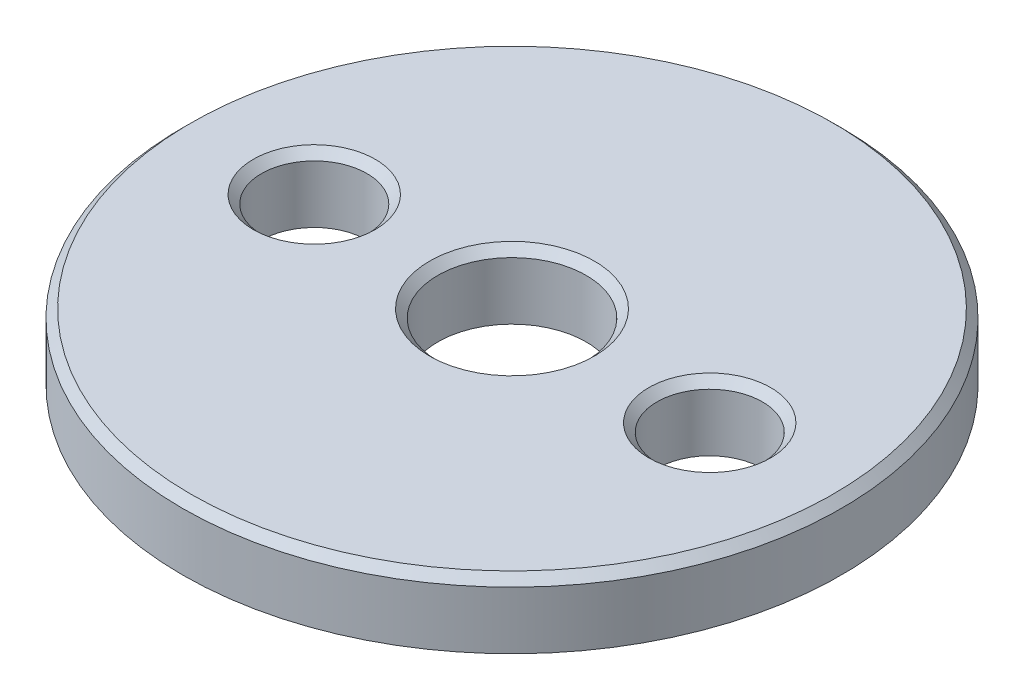
ISO-10303-21;
HEADER;
FILE_DESCRIPTION(('STEP AP214'),'2;1');
FILE_NAME('part.step','',(''),(''),'','','');
FILE_SCHEMA(('AUTOMOTIVE_DESIGN { 1 0 10303 214 1 1 1 1 }'));
ENDSEC;
DATA;
#1=APPLICATION_CONTEXT('core data for automotive mechanical design processes');
#2=APPLICATION_PROTOCOL_DEFINITION('international standard','automotive_design',2000,#1);
#3=PRODUCT_CONTEXT('',#1,'mechanical');
#4=PRODUCT('Part','Part','',(#3));
#5=PRODUCT_RELATED_PRODUCT_CATEGORY('part','',(#4));
#6=PRODUCT_DEFINITION_FORMATION('','',#4);
#7=PRODUCT_DEFINITION_CONTEXT('part definition',#1,'design');
#8=PRODUCT_DEFINITION('design','',#6,#7);
#9=PRODUCT_DEFINITION_SHAPE('','',#8);
#10=(LENGTH_UNIT() NAMED_UNIT(*) SI_UNIT(.MILLI.,.METRE.));
#11=(NAMED_UNIT(*) PLANE_ANGLE_UNIT() SI_UNIT($,.RADIAN.));
#12=(NAMED_UNIT(*) SI_UNIT($,.STERADIAN.) SOLID_ANGLE_UNIT());
#13=UNCERTAINTY_MEASURE_WITH_UNIT(LENGTH_MEASURE(1.E-05),#10,'distance_accuracy_value','');
#14=(GEOMETRIC_REPRESENTATION_CONTEXT(3) GLOBAL_UNCERTAINTY_ASSIGNED_CONTEXT((#13)) GLOBAL_UNIT_ASSIGNED_CONTEXT((#10,
#11,#12)) REPRESENTATION_CONTEXT('',''));
#15=CARTESIAN_POINT('',(0.,0.,0.));
#16=DIRECTION('',(0.,0.,1.));
#17=DIRECTION('',(1.,0.,0.));
#18=AXIS2_PLACEMENT_3D('',#15,#16,#17);
#19=CARTESIAN_POINT('',(0.,2.,0.));
#20=DIRECTION('',(0.,1.,0.));
#21=DIRECTION('',(0.,0.,1.));
#22=AXIS2_PLACEMENT_3D('',#19,#20,#21);
#23=PLANE('',#22);
#24=CARTESIAN_POINT('',(6.,2.,0.));
#25=DIRECTION('',(0.,1.,0.));
#26=DIRECTION('',(0.,0.,1.));
#27=AXIS2_PLACEMENT_3D('',#24,#25,#26);
#28=CIRCLE('',#27,1.85);
#29=CARTESIAN_POINT('',(6.,2.,1.85));
#30=VERTEX_POINT('',#29);
#31=EDGE_CURVE('E46',#30,#30,#28,.F.);
#32=ORIENTED_EDGE('',*,*,#31,.T.);
#33=EDGE_LOOP('',(#32));
#34=FACE_BOUND('',#33,.T.);
#35=CARTESIAN_POINT('',(0.,2.,0.));
#36=DIRECTION('',(0.,1.,0.));
#37=DIRECTION('',(0.,0.,1.));
#38=AXIS2_PLACEMENT_3D('',#35,#36,#37);
#39=CIRCLE('',#38,2.5);
#40=CARTESIAN_POINT('',(0.,2.,2.5));
#41=VERTEX_POINT('',#40);
#42=EDGE_CURVE('E51',#41,#41,#39,.F.);
#43=ORIENTED_EDGE('',*,*,#42,.T.);
#44=EDGE_LOOP('',(#43));
#45=FACE_BOUND('',#44,.T.);
#46=CARTESIAN_POINT('',(-6.,2.,0.));
#47=DIRECTION('',(0.,1.,0.));
#48=DIRECTION('',(0.,0.,1.));
#49=AXIS2_PLACEMENT_3D('',#46,#47,#48);
#50=CIRCLE('',#49,1.85);
#51=CARTESIAN_POINT('',(-6.,2.,1.85));
#52=VERTEX_POINT('',#51);
#53=EDGE_CURVE('E54',#52,#52,#50,.F.);
#54=ORIENTED_EDGE('',*,*,#53,.T.);
#55=EDGE_LOOP('',(#54));
#56=FACE_BOUND('',#55,.T.);
#57=CARTESIAN_POINT('',(0.,2.,0.));
#58=DIRECTION('',(0.,1.,0.));
#59=DIRECTION('',(0.,0.,1.));
#60=AXIS2_PLACEMENT_3D('',#57,#58,#59);
#61=CIRCLE('',#60,9.75000000000001);
#62=CARTESIAN_POINT('',(0.,2.,9.75000000000001));
#63=VERTEX_POINT('',#62);
#64=EDGE_CURVE('E57',#63,#63,#61,.T.);
#65=ORIENTED_EDGE('',*,*,#64,.T.);
#66=EDGE_LOOP('',(#65));
#67=FACE_BOUND('',#66,.T.);
#68=ADVANCED_FACE('F31',(#34,#45,#56,#67),#23,.T.);
#69=CARTESIAN_POINT('',(0.,0.,0.));
#70=DIRECTION('',(0.,1.,0.));
#71=DIRECTION('',(0.,0.,1.));
#72=AXIS2_PLACEMENT_3D('',#69,#70,#71);
#73=PLANE('',#72);
#74=CARTESIAN_POINT('',(0.,0.,0.));
#75=DIRECTION('',(0.,1.,0.));
#76=DIRECTION('',(0.,0.,1.));
#77=AXIS2_PLACEMENT_3D('',#74,#75,#76);
#78=CIRCLE('',#77,10.);
#79=CARTESIAN_POINT('',(0.,0.,10.));
#80=VERTEX_POINT('',#79);
#81=EDGE_CURVE('E63',#80,#80,#78,.T.);
#82=ORIENTED_EDGE('',*,*,#81,.F.);
#83=EDGE_LOOP('',(#82));
#84=FACE_BOUND('',#83,.T.);
#85=CARTESIAN_POINT('',(-6.,0.,0.));
#86=DIRECTION('',(0.,1.,0.));
#87=DIRECTION('',(0.,0.,1.));
#88=AXIS2_PLACEMENT_3D('',#85,#86,#87);
#89=CIRCLE('',#88,1.6);
#90=CARTESIAN_POINT('',(-6.,0.,1.6));
#91=VERTEX_POINT('',#90);
#92=EDGE_CURVE('E66',#91,#91,#89,.T.);
#93=ORIENTED_EDGE('',*,*,#92,.T.);
#94=EDGE_LOOP('',(#93));
#95=FACE_BOUND('',#94,.T.);
#96=CARTESIAN_POINT('',(6.,0.,0.));
#97=DIRECTION('',(0.,1.,0.));
#98=DIRECTION('',(0.,0.,1.));
#99=AXIS2_PLACEMENT_3D('',#96,#97,#98);
#100=CIRCLE('',#99,1.6);
#101=CARTESIAN_POINT('',(6.,0.,1.6));
#102=VERTEX_POINT('',#101);
#103=EDGE_CURVE('E69',#102,#102,#100,.T.);
#104=ORIENTED_EDGE('',*,*,#103,.T.);
#105=EDGE_LOOP('',(#104));
#106=FACE_BOUND('',#105,.T.);
#107=CARTESIAN_POINT('',(0.,0.,0.));
#108=DIRECTION('',(0.,1.,0.));
#109=DIRECTION('',(0.,0.,1.));
#110=AXIS2_PLACEMENT_3D('',#107,#108,#109);
#111=CIRCLE('',#110,2.25);
#112=CARTESIAN_POINT('',(0.,0.,2.25));
#113=VERTEX_POINT('',#112);
#114=EDGE_CURVE('E72',#113,#113,#111,.T.);
#115=ORIENTED_EDGE('',*,*,#114,.T.);
#116=EDGE_LOOP('',(#115));
#117=FACE_BOUND('',#116,.T.);
#118=ADVANCED_FACE('F76',(#84,#95,#106,#117),#73,.F.);
#119=CARTESIAN_POINT('',(0.,2.,0.));
#120=DIRECTION('',(0.,-1.,0.));
#121=DIRECTION('',(0.,0.,-1.));
#122=AXIS2_PLACEMENT_3D('',#119,#120,#121);
#123=CYLINDRICAL_SURFACE('',#122,10.);
#124=CARTESIAN_POINT('',(0.,1.75,0.));
#125=DIRECTION('',(0.,1.,0.));
#126=DIRECTION('',(0.,0.,1.));
#127=AXIS2_PLACEMENT_3D('',#124,#125,#126);
#128=CIRCLE('',#127,10.);
#129=CARTESIAN_POINT('',(0.,1.75,10.));
#130=VERTEX_POINT('',#129);
#131=EDGE_CURVE('E10',#130,#130,#128,.F.);
#132=ORIENTED_EDGE('',*,*,#131,.T.);
#133=EDGE_LOOP('',(#132));
#134=FACE_BOUND('',#133,.T.);
#135=ORIENTED_EDGE('',*,*,#81,.T.);
#136=EDGE_LOOP('',(#135));
#137=FACE_BOUND('',#136,.T.);
#138=ADVANCED_FACE('F100',(#134,#137),#123,.T.);
#139=CARTESIAN_POINT('',(-6.,2.,0.));
#140=DIRECTION('',(0.,-1.,0.));
#141=DIRECTION('',(0.,0.,-1.));
#142=AXIS2_PLACEMENT_3D('',#139,#140,#141);
#143=CYLINDRICAL_SURFACE('',#142,1.6);
#144=CARTESIAN_POINT('',(-6.,1.75,0.));
#145=DIRECTION('',(0.,1.,0.));
#146=DIRECTION('',(0.,0.,1.));
#147=AXIS2_PLACEMENT_3D('',#144,#145,#146);
#148=CIRCLE('',#147,1.6);
#149=CARTESIAN_POINT('',(-6.,1.75,1.6));
#150=VERTEX_POINT('',#149);
#151=EDGE_CURVE('E38',#150,#150,#148,.T.);
#152=ORIENTED_EDGE('',*,*,#151,.T.);
#153=EDGE_LOOP('',(#152));
#154=FACE_BOUND('',#153,.T.);
#155=ORIENTED_EDGE('',*,*,#92,.F.);
#156=EDGE_LOOP('',(#155));
#157=FACE_BOUND('',#156,.T.);
#158=ADVANCED_FACE('F91',(#154,#157),#143,.F.);
#159=CARTESIAN_POINT('',(6.,2.,0.));
#160=DIRECTION('',(0.,-1.,0.));
#161=DIRECTION('',(0.,0.,-1.));
#162=AXIS2_PLACEMENT_3D('',#159,#160,#161);
#163=CYLINDRICAL_SURFACE('',#162,1.6);
#164=CARTESIAN_POINT('',(6.,1.75,0.));
#165=DIRECTION('',(0.,1.,0.));
#166=DIRECTION('',(0.,0.,1.));
#167=AXIS2_PLACEMENT_3D('',#164,#165,#166);
#168=CIRCLE('',#167,1.6);
#169=CARTESIAN_POINT('',(6.,1.75,1.6));
#170=VERTEX_POINT('',#169);
#171=EDGE_CURVE('E60',#170,#170,#168,.T.);
#172=ORIENTED_EDGE('',*,*,#171,.T.);
#173=EDGE_LOOP('',(#172));
#174=FACE_BOUND('',#173,.T.);
#175=ORIENTED_EDGE('',*,*,#103,.F.);
#176=EDGE_LOOP('',(#175));
#177=FACE_BOUND('',#176,.T.);
#178=ADVANCED_FACE('F81',(#174,#177),#163,.F.);
#179=CARTESIAN_POINT('',(0.,2.,0.));
#180=DIRECTION('',(0.,-1.,0.));
#181=DIRECTION('',(0.,0.,-1.));
#182=AXIS2_PLACEMENT_3D('',#179,#180,#181);
#183=CYLINDRICAL_SURFACE('',#182,2.25);
#184=CARTESIAN_POINT('',(0.,1.75,0.));
#185=DIRECTION('',(0.,1.,0.));
#186=DIRECTION('',(0.,0.,1.));
#187=AXIS2_PLACEMENT_3D('',#184,#185,#186);
#188=CIRCLE('',#187,2.25);
#189=CARTESIAN_POINT('',(0.,1.75,2.25));
#190=VERTEX_POINT('',#189);
#191=EDGE_CURVE('E42',#190,#190,#188,.T.);
#192=ORIENTED_EDGE('',*,*,#191,.T.);
#193=EDGE_LOOP('',(#192));
#194=FACE_BOUND('',#193,.T.);
#195=ORIENTED_EDGE('',*,*,#114,.F.);
#196=EDGE_LOOP('',(#195));
#197=FACE_BOUND('',#196,.T.);
#198=ADVANCED_FACE('F78',(#194,#197),#183,.F.);
#199=CARTESIAN_POINT('',(6.,1.75,0.));
#200=DIRECTION('',(0.,1.,0.));
#201=DIRECTION('',(0.,0.,1.));
#202=AXIS2_PLACEMENT_3D('',#199,#200,#201);
#203=CONICAL_SURFACE('',#202,1.6,0.785398163397444);
#204=ORIENTED_EDGE('',*,*,#31,.F.);
#205=EDGE_LOOP('',(#204));
#206=FACE_BOUND('',#205,.T.);
#207=ORIENTED_EDGE('',*,*,#171,.F.);
#208=EDGE_LOOP('',(#207));
#209=FACE_BOUND('',#208,.T.);
#210=ADVANCED_FACE('F80',(#206,#209),#203,.F.);
#211=CARTESIAN_POINT('',(0.,1.75,0.));
#212=DIRECTION('',(0.,1.,0.));
#213=DIRECTION('',(0.,0.,1.));
#214=AXIS2_PLACEMENT_3D('',#211,#212,#213);
#215=CONICAL_SURFACE('',#214,2.25,0.785398163397453);
#216=ORIENTED_EDGE('',*,*,#42,.F.);
#217=EDGE_LOOP('',(#216));
#218=FACE_BOUND('',#217,.T.);
#219=ORIENTED_EDGE('',*,*,#191,.F.);
#220=EDGE_LOOP('',(#219));
#221=FACE_BOUND('',#220,.T.);
#222=ADVANCED_FACE('F88',(#218,#221),#215,.F.);
#223=CARTESIAN_POINT('',(-6.,1.75,0.));
#224=DIRECTION('',(0.,1.,0.));
#225=DIRECTION('',(0.,0.,1.));
#226=AXIS2_PLACEMENT_3D('',#223,#224,#225);
#227=CONICAL_SURFACE('',#226,1.6,0.785398163397444);
#228=ORIENTED_EDGE('',*,*,#53,.F.);
#229=EDGE_LOOP('',(#228));
#230=FACE_BOUND('',#229,.T.);
#231=ORIENTED_EDGE('',*,*,#151,.F.);
#232=EDGE_LOOP('',(#231));
#233=FACE_BOUND('',#232,.T.);
#234=ADVANCED_FACE('F109',(#230,#233),#227,.F.);
#235=CARTESIAN_POINT('',(0.,2.,0.));
#236=DIRECTION('',(0.,-1.,0.));
#237=DIRECTION('',(0.,0.,-1.));
#238=AXIS2_PLACEMENT_3D('',#235,#236,#237);
#239=CONICAL_SURFACE('',#238,9.75000000000001,0.785398163397441);
#240=ORIENTED_EDGE('',*,*,#131,.F.);
#241=EDGE_LOOP('',(#240));
#242=FACE_BOUND('',#241,.T.);
#243=ORIENTED_EDGE('',*,*,#64,.F.);
#244=EDGE_LOOP('',(#243));
#245=FACE_BOUND('',#244,.T.);
#246=ADVANCED_FACE('F33',(#242,#245),#239,.T.);
#247=CLOSED_SHELL('',(#68,#118,#138,#158,#178,#198,#210,#222,#234,#246));
#248=MANIFOLD_SOLID_BREP('B2',#247);
#249=ADVANCED_BREP_SHAPE_REPRESENTATION('',(#18,#248),#14);
#250=SHAPE_DEFINITION_REPRESENTATION(#9,#249);
ENDSEC;
END-ISO-10303-21;
